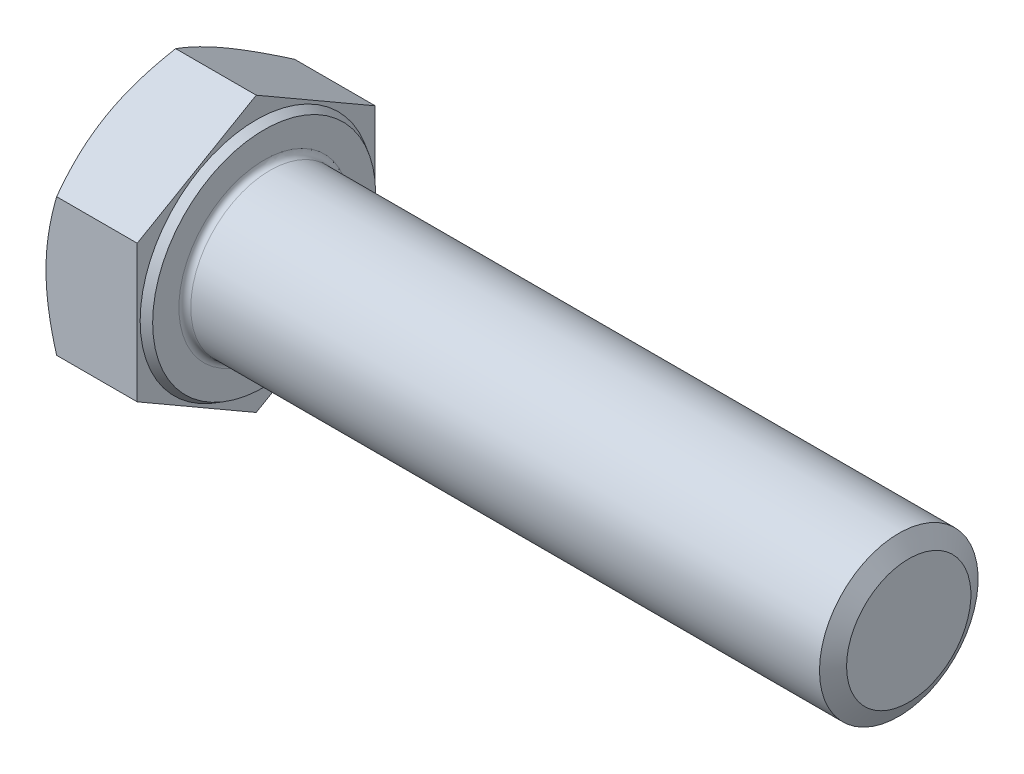
ISO-10303-21;
HEADER;
FILE_DESCRIPTION(('STEP AP214'),'2;1');
FILE_NAME('part.step','',(''),(''),'','','');
FILE_SCHEMA(('AUTOMOTIVE_DESIGN { 1 0 10303 214 1 1 1 1 }'));
ENDSEC;
DATA;
#1=APPLICATION_CONTEXT('core data for automotive mechanical design processes');
#2=APPLICATION_PROTOCOL_DEFINITION('international standard','automotive_design',2000,#1);
#3=PRODUCT_CONTEXT('',#1,'mechanical');
#4=PRODUCT('Part','Part','',(#3));
#5=PRODUCT_RELATED_PRODUCT_CATEGORY('part','',(#4));
#6=PRODUCT_DEFINITION_FORMATION('','',#4);
#7=PRODUCT_DEFINITION_CONTEXT('part definition',#1,'design');
#8=PRODUCT_DEFINITION('design','',#6,#7);
#9=PRODUCT_DEFINITION_SHAPE('','',#8);
#10=(LENGTH_UNIT() NAMED_UNIT(*) SI_UNIT(.MILLI.,.METRE.));
#11=(NAMED_UNIT(*) PLANE_ANGLE_UNIT() SI_UNIT($,.RADIAN.));
#12=(NAMED_UNIT(*) SI_UNIT($,.STERADIAN.) SOLID_ANGLE_UNIT());
#13=UNCERTAINTY_MEASURE_WITH_UNIT(LENGTH_MEASURE(1.E-05),#10,'distance_accuracy_value','');
#14=(GEOMETRIC_REPRESENTATION_CONTEXT(3) GLOBAL_UNCERTAINTY_ASSIGNED_CONTEXT((#13)) GLOBAL_UNIT_ASSIGNED_CONTEXT((#10,
#11,#12)) REPRESENTATION_CONTEXT('',''));
#15=CARTESIAN_POINT('',(0.,0.,0.));
#16=DIRECTION('',(0.,0.,1.));
#17=DIRECTION('',(1.,0.,0.));
#18=AXIS2_PLACEMENT_3D('',#15,#16,#17);
#19=CARTESIAN_POINT('',(0.,0.,0.));
#20=DIRECTION('',(-1.,0.,0.));
#21=DIRECTION('',(0.,0.,1.));
#22=AXIS2_PLACEMENT_3D('',#19,#20,#21);
#23=CYLINDRICAL_SURFACE('',#22,8.);
#24=CARTESIAN_POINT('',(10.6,0.,0.));
#25=DIRECTION('',(1.,0.,0.));
#26=DIRECTION('',(0.,0.,-1.));
#27=AXIS2_PLACEMENT_3D('',#24,#25,#26);
#28=CIRCLE('',#27,8.);
#29=CARTESIAN_POINT('',(10.6,0.,-8.));
#30=VERTEX_POINT('',#29);
#31=EDGE_CURVE('E11',#30,#30,#28,.T.);
#32=ORIENTED_EDGE('',*,*,#31,.T.);
#33=EDGE_LOOP('',(#32));
#34=FACE_BOUND('',#33,.T.);
#35=CARTESIAN_POINT('',(74.,0.,0.));
#36=DIRECTION('',(-1.,0.,0.));
#37=DIRECTION('',(0.,0.,1.));
#38=AXIS2_PLACEMENT_3D('',#35,#36,#37);
#39=CIRCLE('',#38,8.);
#40=CARTESIAN_POINT('',(74.,0.,8.));
#41=VERTEX_POINT('',#40);
#42=EDGE_CURVE('E453',#41,#41,#39,.T.);
#43=ORIENTED_EDGE('',*,*,#42,.T.);
#44=EDGE_LOOP('',(#43));
#45=FACE_BOUND('',#44,.T.);
#46=ADVANCED_FACE('F48',(#34,#45),#23,.T.);
#47=CARTESIAN_POINT('',(10.,6.9282032302755,-12.));
#48=DIRECTION('',(0.,-0.866025403784438,0.500000000000001));
#49=DIRECTION('',(0.,-0.500000000000001,-0.866025403784438));
#50=AXIS2_PLACEMENT_3D('',#47,#48,#49);
#51=PLANE('',#50);
#52=DIRECTION('',(0.,0.500000000000001,0.866025403784438));
#53=VECTOR('',#52,1.);
#54=CARTESIAN_POINT('',(9.2,6.9282032302755,-12.));
#55=LINE('',#54,#53);
#56=CARTESIAN_POINT('',(9.2,6.92820323027552,-12.));
#57=VERTEX_POINT('',#56);
#58=CARTESIAN_POINT('',(9.2,13.856406460551,0.));
#59=VERTEX_POINT('',#58);
#60=EDGE_CURVE('E125',#57,#59,#55,.T.);
#61=ORIENTED_EDGE('',*,*,#60,.F.);
#62=DIRECTION('',(-1.,0.,0.));
#63=VECTOR('',#62,1.);
#64=CARTESIAN_POINT('',(10.,6.9282032302755,-12.));
#65=LINE('',#64,#63);
#66=CARTESIAN_POINT('',(1.07179676972448,6.9282032302755,-12.));
#67=VERTEX_POINT('',#66);
#68=EDGE_CURVE('E311',#57,#67,#65,.T.);
#69=ORIENTED_EDGE('',*,*,#68,.T.);
#70=CARTESIAN_POINT('',(1.07186343722448,13.8565219306049,0.0002));
#71=CARTESIAN_POINT('',(0.983949632185865,13.7042251307133,-0.263585795242262));
#72=CARTESIAN_POINT('',(0.900025997556671,13.5513604901482,-0.528355119381799));
#73=CARTESIAN_POINT('',(0.741266218872845,13.244405350712,-1.06001701652966));
#74=CARTESIAN_POINT('',(0.666433063673587,13.0903144663124,-1.32691025729307));
#75=CARTESIAN_POINT('',(0.457017539854156,12.6255589607763,-2.13189040597901));
#76=CARTESIAN_POINT('',(0.337903236722855,12.3130596590925,-2.6731550738251));
#77=CARTESIAN_POINT('',(0.198231061003147,11.8454187840152,-3.483132829155));
#78=CARTESIAN_POINT('',(0.158443797040446,11.6916742921315,-3.74942610048137));
#79=CARTESIAN_POINT('',(0.0917233692170911,11.3834734611381,-4.28324559869684));
#80=CARTESIAN_POINT('',(0.0647904527677754,11.2290171083848,-4.55077184921738));
#81=CARTESIAN_POINT('',(0.0244685919169262,10.9198468953819,-5.08627036632535));
#82=CARTESIAN_POINT('',(0.0110635528823189,10.7651335610083,-5.35424172206873));
#83=CARTESIAN_POINT('',(-0.00191690624283213,10.4555635369292,-5.89043273227404));
#84=CARTESIAN_POINT('',(-0.00149275363726567,10.3007068518009,-6.15865237880804));
#85=CARTESIAN_POINT('',(0.0122200193427722,10.011202064883,-6.6600893787841));
#86=CARTESIAN_POINT('',(0.0238359825785307,9.87653331649855,-6.89334249317776));
#87=CARTESIAN_POINT('',(0.0573080088723785,9.60750555673725,-7.35931224173077));
#88=CARTESIAN_POINT('',(0.0791647962662185,9.47314656794543,-7.59202883677177));
#89=CARTESIAN_POINT('',(0.13273741654291,9.20481134519089,-8.05679907604294));
#90=CARTESIAN_POINT('',(0.164461392492924,9.07083551994084,-8.288852012362));
#91=CARTESIAN_POINT('',(0.237211775670441,8.80351197901488,-8.75186996730498));
#92=CARTESIAN_POINT('',(0.278238815183198,8.67016430666066,-8.98283491089354));
#93=CARTESIAN_POINT('',(0.416311653281804,8.2653799638421,-9.68394195876367));
#94=CARTESIAN_POINT('',(0.527124888339327,7.99511549730955,-10.1520537462785));
#95=CARTESIAN_POINT('',(0.778625766937884,7.45861659251288,-11.0812971075914));
#96=CARTESIAN_POINT('',(0.919254342659384,7.19237528499142,-11.5424405792922));
#97=CARTESIAN_POINT('',(1.07186343722448,6.92808776022166,-12.0002));
#98=B_SPLINE_CURVE_WITH_KNOTS('',3,(#70,#71,#72,#73,#74,#75,#76,#77,#78,#79,#80,#81,#82,#83,#84,
#85,#86,#87,#88,#89,#90,#91,#92,#93,#94,#95,#96,#97),.UNSPECIFIED.,.F.,.F.,(4,2,2,2,2,2,2,2,2,2,
2,2,2,4),(0.,0.951004872251246,1.90232158356438,3.80900466161369,4.73894551413571,
5.6689042647761,6.59775529889866,7.52657763276931,8.33514643820579,9.1437724425275,
9.95306755799766,10.7624176939264,12.4167102786892,14.0677556316691),.UNSPECIFIED.);
#99=CARTESIAN_POINT('',(0.,10.3923048454133,-6.00000000000001));
#100=VERTEX_POINT('',#99);
#101=EDGE_CURVE('E236',#100,#67,#98,.T.);
#102=ORIENTED_EDGE('',*,*,#101,.F.);
#103=CARTESIAN_POINT('',(1.07179676972449,13.856406460551,0.));
#104=VERTEX_POINT('',#103);
#105=EDGE_CURVE('E71',#104,#100,#98,.T.);
#106=ORIENTED_EDGE('',*,*,#105,.F.);
#107=DIRECTION('',(-1.,0.,0.));
#108=VECTOR('',#107,1.);
#109=CARTESIAN_POINT('',(10.,13.856406460551,0.));
#110=LINE('',#109,#108);
#111=EDGE_CURVE('E144',#59,#104,#110,.T.);
#112=ORIENTED_EDGE('',*,*,#111,.F.);
#113=EDGE_LOOP('',(#61,#69,#102,#106,#112));
#114=FACE_BOUND('',#113,.T.);
#115=ADVANCED_FACE('F179',(#114),#51,.F.);
#116=CARTESIAN_POINT('',(10.,13.856406460551,0.));
#117=DIRECTION('',(0.,-0.866025403784438,-0.500000000000001));
#118=DIRECTION('',(0.,0.500000000000001,-0.866025403784438));
#119=AXIS2_PLACEMENT_3D('',#116,#117,#118);
#120=PLANE('',#119);
#121=DIRECTION('',(0.,-0.500000000000001,0.866025403784438));
#122=VECTOR('',#121,1.);
#123=CARTESIAN_POINT('',(9.2,13.856406460551,0.));
#124=LINE('',#123,#122);
#125=CARTESIAN_POINT('',(9.2,6.92820323027553,12.));
#126=VERTEX_POINT('',#125);
#127=EDGE_CURVE('E119',#59,#126,#124,.T.);
#128=ORIENTED_EDGE('',*,*,#127,.F.);
#129=ORIENTED_EDGE('',*,*,#111,.T.);
#130=CARTESIAN_POINT('',(1.07186343722448,6.92808776022166,12.0002));
#131=CARTESIAN_POINT('',(0.983949632185859,7.08038456011318,11.7364142047577));
#132=CARTESIAN_POINT('',(0.900025997556666,7.2332492006783,11.4716448806182));
#133=CARTESIAN_POINT('',(0.74126621887284,7.54020434011449,10.9399829834703));
#134=CARTESIAN_POINT('',(0.666433063673582,7.69429522451413,10.6730897427069));
#135=CARTESIAN_POINT('',(0.45701753985415,8.15905073005026,9.86810959402099));
#136=CARTESIAN_POINT('',(0.337903236722848,8.47155003173404,9.3268449261749));
#137=CARTESIAN_POINT('',(0.198231061003143,8.93919090681137,8.51686717084501));
#138=CARTESIAN_POINT('',(0.158443797040443,9.09293539869503,8.25057389951863));
#139=CARTESIAN_POINT('',(0.09172336921709,9.40113622968841,7.71675440130316));
#140=CARTESIAN_POINT('',(0.0647904527677747,9.55559258244173,7.44922815078262));
#141=CARTESIAN_POINT('',(0.0244685919169258,9.86476279544466,6.91372963367465));
#142=CARTESIAN_POINT('',(0.0110635528823185,10.0194761298182,6.64575827793128));
#143=CARTESIAN_POINT('',(-0.00191690624283177,10.3290461538973,6.10956726772596));
#144=CARTESIAN_POINT('',(-0.00149275363726467,10.4839028390257,5.84134762119196));
#145=CARTESIAN_POINT('',(0.0122200193427742,10.7734076259435,5.3399106212159));
#146=CARTESIAN_POINT('',(0.023835982578533,10.908076374328,5.10665750682225));
#147=CARTESIAN_POINT('',(0.0573080088723811,11.1771041340893,4.64068775826924));
#148=CARTESIAN_POINT('',(0.0791647962662211,11.3114631228811,4.40797116322823));
#149=CARTESIAN_POINT('',(0.132737416542913,11.5797983456356,3.94320092395706));
#150=CARTESIAN_POINT('',(0.164461392492928,11.7137741708857,3.711147987638));
#151=CARTESIAN_POINT('',(0.237211775670446,11.9810977118116,3.24813003269502));
#152=CARTESIAN_POINT('',(0.278238815183203,12.1144453841659,3.01716508910646));
#153=CARTESIAN_POINT('',(0.416311653281809,12.5192297269844,2.31605804123633));
#154=CARTESIAN_POINT('',(0.527124888339332,12.789494193517,1.84794625372147));
#155=CARTESIAN_POINT('',(0.77862576693789,13.3259930983136,0.918702892408578));
#156=CARTESIAN_POINT('',(0.91925434265939,13.5922344058351,0.457559420707846));
#157=CARTESIAN_POINT('',(1.07186343722448,13.8565219306049,-0.000200000000000254));
#158=B_SPLINE_CURVE_WITH_KNOTS('',3,(#130,#131,#132,#133,#134,#135,#136,#137,#138,#139,#140,
#141,#142,#143,#144,#145,#146,#147,#148,#149,#150,#151,#152,#153,#154,#155,#156,#157),
.UNSPECIFIED.,.F.,.F.,(4,2,2,2,2,2,2,2,2,2,2,2,2,4),(0.,0.951004872251245,1.90232158356437,
3.80900466161369,4.7389455141357,5.66890426477609,6.59775529889866,7.5265776327693,
8.33514643820579,9.1437724425275,9.95306755799766,10.7624176939264,12.4167102786892,
14.0677556316691),.UNSPECIFIED.);
#159=CARTESIAN_POINT('',(0.,10.3923048454133,6.00000000000001));
#160=VERTEX_POINT('',#159);
#161=EDGE_CURVE('E248',#160,#104,#158,.T.);
#162=ORIENTED_EDGE('',*,*,#161,.F.);
#163=CARTESIAN_POINT('',(1.07179676972448,6.9282032302755,12.));
#164=VERTEX_POINT('',#163);
#165=EDGE_CURVE('E143',#164,#160,#158,.T.);
#166=ORIENTED_EDGE('',*,*,#165,.F.);
#167=DIRECTION('',(-1.,0.,0.));
#168=VECTOR('',#167,1.);
#169=CARTESIAN_POINT('',(10.,6.9282032302755,12.));
#170=LINE('',#169,#168);
#171=EDGE_CURVE('E134',#126,#164,#170,.T.);
#172=ORIENTED_EDGE('',*,*,#171,.F.);
#173=EDGE_LOOP('',(#128,#129,#162,#166,#172));
#174=FACE_BOUND('',#173,.T.);
#175=ADVANCED_FACE('F141',(#174),#120,.F.);
#176=CARTESIAN_POINT('',(10.,6.9282032302755,12.));
#177=DIRECTION('',(0.,0.,-1.));
#178=DIRECTION('',(-1.,0.,0.));
#179=AXIS2_PLACEMENT_3D('',#176,#177,#178);
#180=PLANE('',#179);
#181=DIRECTION('',(0.,-1.,0.));
#182=VECTOR('',#181,1.);
#183=CARTESIAN_POINT('',(9.2,6.9282032302755,12.));
#184=LINE('',#183,#182);
#185=CARTESIAN_POINT('',(9.2,-6.92820323027552,12.));
#186=VERTEX_POINT('',#185);
#187=EDGE_CURVE('E122',#126,#186,#184,.T.);
#188=ORIENTED_EDGE('',*,*,#187,.F.);
#189=ORIENTED_EDGE('',*,*,#171,.T.);
#190=CARTESIAN_POINT('',(5.9379652249916,-18.7780422876809,12.));
#191=CARTESIAN_POINT('',(5.81013580153171,-18.5152821742341,12.));
#192=CARTESIAN_POINT('',(5.68293119845564,-18.2522182359297,12.));
#193=CARTESIAN_POINT('',(5.42991281410037,-17.7254193681017,12.));
#194=CARTESIAN_POINT('',(5.30409904630056,-17.4616844321055,12.));
#195=CARTESIAN_POINT('',(4.92892368290875,-16.6693101743882,12.));
#196=CARTESIAN_POINT('',(4.68186469152994,-16.1395765656331,12.));
#197=CARTESIAN_POINT('',(4.19405479952982,-15.0738169190078,12.));
#198=CARTESIAN_POINT('',(3.95334413341026,-14.5377724221017,12.));
#199=CARTESIAN_POINT('',(3.48154718674623,-13.4614790602081,12.));
#200=CARTESIAN_POINT('',(3.25046046260965,-12.9212303903669,12.));
#201=CARTESIAN_POINT('',(2.79294900667129,-11.8175688689819,12.));
#202=CARTESIAN_POINT('',(2.56693655895501,-11.2539842320577,12.));
#203=CARTESIAN_POINT('',(2.13161283273163,-10.1202797331247,12.));
#204=CARTESIAN_POINT('',(1.92230340506571,-9.55015915485907,12.));
#205=CARTESIAN_POINT('',(1.52576124918553,-8.40350794466347,12.));
#206=CARTESIAN_POINT('',(1.33848523718246,-7.82699240007888,12.));
#207=CARTESIAN_POINT('',(0.99189670018006,-6.66563869600162,12.));
#208=CARTESIAN_POINT('',(0.832575542892166,-6.08080316618919,12.));
#209=CARTESIAN_POINT('',(0.62068119702557,-5.19882791551971,12.));
#210=CARTESIAN_POINT('',(0.55471315085529,-4.90488790342147,12.));
#211=CARTESIAN_POINT('',(0.432574422995981,-4.31496880701142,12.));
#212=CARTESIAN_POINT('',(0.37640354844944,-4.01898976295725,12.));
#213=CARTESIAN_POINT('',(0.274840044165109,-3.42518449183526,12.));
#214=CARTESIAN_POINT('',(0.229447213467064,-3.1273582993144,12.));
#215=CARTESIAN_POINT('',(0.150338666864213,-2.53016033534832,12.));
#216=CARTESIAN_POINT('',(0.116622484244828,-2.23078862616279,12.));
#217=CARTESIAN_POINT('',(0.061969320128323,-1.63489952034464,12.));
#218=CARTESIAN_POINT('',(0.0408679219512438,-1.33839729705375,12.));
#219=CARTESIAN_POINT('',(0.0112310519021945,-0.744766224338127,12.));
#220=CARTESIAN_POINT('',(0.00269536679662729,-0.447637385632423,12.));
#221=CARTESIAN_POINT('',(-0.00160621157202331,0.146715096942927,12.));
#222=CARTESIAN_POINT('',(0.00262788821472195,0.443938740760886,12.));
#223=CARTESIAN_POINT('',(0.0237602868313374,1.03793867900077,12.));
#224=CARTESIAN_POINT('',(0.0406591751133799,1.33471495195666,12.));
#225=CARTESIAN_POINT('',(0.0957363037225937,2.04293812544911,12.));
#226=CARTESIAN_POINT('',(0.139644388869434,2.45394931182504,12.));
#227=CARTESIAN_POINT('',(0.249393763135934,3.27301119833394,12.));
#228=CARTESIAN_POINT('',(0.315237895547362,3.68106150767658,12.));
#229=CARTESIAN_POINT('',(0.542190666924389,4.90025554060104,12.));
#230=CARTESIAN_POINT('',(0.732681274216202,5.70600726238708,12.));
#231=CARTESIAN_POINT('',(1.06415793334627,6.91101760118602,12.));
#232=CARTESIAN_POINT('',(1.18384338751807,7.31649624625233,12.));
#233=CARTESIAN_POINT('',(1.43593551476421,8.12351840181149,12.));
#234=CARTESIAN_POINT('',(1.56834227450981,8.52506188547325,12.));
#235=CARTESIAN_POINT('',(1.8437286581276,9.32433402651663,12.));
#236=CARTESIAN_POINT('',(1.9867050037192,9.72206382387893,12.));
#237=CARTESIAN_POINT('',(2.28151949374363,10.5142091061849,12.));
#238=CARTESIAN_POINT('',(2.43335751674009,10.908624636461,12.));
#239=CARTESIAN_POINT('',(2.81137815071346,11.8636440545741,12.));
#240=CARTESIAN_POINT('',(3.04143185567875,12.4227131308577,12.));
#241=CARTESIAN_POINT('',(3.51333410611205,13.5358669332653,12.));
#242=CARTESIAN_POINT('',(3.75518348678292,14.0899513031431,12.));
#243=CARTESIAN_POINT('',(4.24823475653156,15.1941025186566,12.));
#244=CARTESIAN_POINT('',(4.49943904043688,15.7441682918315,12.));
#245=CARTESIAN_POINT('',(5.00924552887371,16.8408349536019,12.));
#246=CARTESIAN_POINT('',(5.26784754956297,17.3874359278899,12.));
#247=CARTESIAN_POINT('',(5.7913387992848,18.4784293923002,12.));
#248=CARTESIAN_POINT('',(6.05623527465221,19.0228183989982,12.));
#249=CARTESIAN_POINT('',(6.59090796254076,20.1091945794083,12.));
#250=CARTESIAN_POINT('',(6.86068419945745,20.6511817410959,12.));
#251=CARTESIAN_POINT('',(7.40421496208664,21.7330545936328,12.));
#252=CARTESIAN_POINT('',(7.67796889125699,22.2729405845111,12.));
#253=CARTESIAN_POINT('',(8.22882461462083,23.3510028742049,12.));
#254=CARTESIAN_POINT('',(8.50592642242827,23.8891791660568,12.));
#255=CARTESIAN_POINT('',(9.29226596146123,25.4066579940567,12.));
#256=CARTESIAN_POINT('',(9.80475659623532,26.3842748096138,12.));
#257=CARTESIAN_POINT('',(10.8366490575024,28.3358962609434,12.));
#258=CARTESIAN_POINT('',(11.3560511647271,29.3099007479222,12.));
#259=CARTESIAN_POINT('',(12.3986980712295,31.2524398572292,12.));
#260=CARTESIAN_POINT('',(12.9219285874181,32.2209821512087,12.));
#261=CARTESIAN_POINT('',(13.709817261168,33.6721037842397,12.));
#262=CARTESIAN_POINT('',(13.9729461083086,34.1555146940213,12.));
#263=CARTESIAN_POINT('',(14.5001155834576,35.1218381868036,12.));
#264=CARTESIAN_POINT('',(14.7641562100751,35.6047507705631,12.));
#265=CARTESIAN_POINT('',(15.0285993289473,36.0874429112689,12.));
#266=B_SPLINE_CURVE_WITH_KNOTS('',3,(#190,#191,#192,#193,#194,#195,#196,#197,#198,#199,#200,
#201,#202,#203,#204,#205,#206,#207,#208,#209,#210,#211,#212,#213,#214,#215,#216,#217,#218,#219,
#220,#221,#222,#223,#224,#225,#226,#227,#228,#229,#230,#231,#232,#233,#234,#235,#236,#237,#238,
#239,#240,#241,#242,#243,#244,#245,#246,#247,#248,#249,#250,#251,#252,#253,#254,#255,#256,#257,
#258,#259,#260,#261,#262,#263,#264,#265),.UNSPECIFIED.,.F.,.F.,(4,2,2,2,2,2,2,2,2,2,2,2,2,2,2,2,
2,2,2,2,2,2,2,2,2,2,2,2,2,2,2,2,2,2,2,2,2,4),(0.,0.876610778943413,1.75323004620523,
3.50671945197806,5.26947518067904,7.03214956933033,8.85359042595666,10.6752328347611,
12.4932347351832,14.3106742559303,15.2142921518805,16.117892258087,17.0214755150421,
17.9250226516858,18.816520871687,19.7080039632539,20.5994865696161,21.4910106704728,
22.7303633484055,23.9698767304575,26.4502079763428,27.7184187234137,28.9866381115161,
30.2544657836991,31.5222760862275,33.3357454112635,35.1493433274816,36.9634087547281,
38.7774291394606,40.5936500751824,42.4098800933003,44.2258404831105,46.0418082599001,
49.3531754129826,52.664677481008,55.9671781132062,57.6183303465534,59.2694800621134),.UNSPECIFIED.);
#267=CARTESIAN_POINT('',(0.,0.,12.));
#268=VERTEX_POINT('',#267);
#269=EDGE_CURVE('E254',#268,#164,#266,.T.);
#270=ORIENTED_EDGE('',*,*,#269,.F.);
#271=CARTESIAN_POINT('',(1.07179676972449,-6.92820323027552,12.));
#272=VERTEX_POINT('',#271);
#273=EDGE_CURVE('E310',#272,#268,#266,.T.);
#274=ORIENTED_EDGE('',*,*,#273,.F.);
#275=DIRECTION('',(-1.,0.,0.));
#276=VECTOR('',#275,1.);
#277=CARTESIAN_POINT('',(10.,-6.92820323027552,12.));
#278=LINE('',#277,#276);
#279=EDGE_CURVE('E137',#186,#272,#278,.T.);
#280=ORIENTED_EDGE('',*,*,#279,.F.);
#281=EDGE_LOOP('',(#188,#189,#270,#274,#280));
#282=FACE_BOUND('',#281,.T.);
#283=ADVANCED_FACE('F132',(#282),#180,.F.);
#284=CARTESIAN_POINT('',(10.,-13.856406460551,0.));
#285=DIRECTION('',(0.,0.866025403784438,-0.500000000000001));
#286=DIRECTION('',(0.,0.500000000000001,0.866025403784438));
#287=AXIS2_PLACEMENT_3D('',#284,#285,#286);
#288=PLANE('',#287);
#289=DIRECTION('',(0.,-0.500000000000001,-0.866025403784438));
#290=VECTOR('',#289,1.);
#291=CARTESIAN_POINT('',(9.2,-13.856406460551,0.));
#292=LINE('',#291,#290);
#293=CARTESIAN_POINT('',(9.2,-13.856406460551,0.));
#294=VERTEX_POINT('',#293);
#295=EDGE_CURVE('E138',#186,#294,#292,.T.);
#296=ORIENTED_EDGE('',*,*,#295,.F.);
#297=ORIENTED_EDGE('',*,*,#279,.T.);
#298=CARTESIAN_POINT('',(1.0718634372245,-13.8565219306049,-0.000199999999999751));
#299=CARTESIAN_POINT('',(0.983949632185878,-13.7042251307134,0.263585795242262));
#300=CARTESIAN_POINT('',(0.900025997556684,-13.5513604901482,0.5283551193818));
#301=CARTESIAN_POINT('',(0.741266218872857,-13.2444053507121,1.06001701652966));
#302=CARTESIAN_POINT('',(0.666433063673599,-13.0903144663124,1.32691025729307));
#303=CARTESIAN_POINT('',(0.457017539854167,-12.6255589607763,2.13189040597901));
#304=CARTESIAN_POINT('',(0.337903236722865,-12.3130596590925,2.67315507382511));
#305=CARTESIAN_POINT('',(0.198231061003158,-11.8454187840152,3.483132829155));
#306=CARTESIAN_POINT('',(0.158443797040457,-11.6916742921315,3.74942610048138));
#307=CARTESIAN_POINT('',(0.0917233692171029,-11.3834734611381,4.28324559869685));
#308=CARTESIAN_POINT('',(0.0647904527677877,-11.2290171083848,4.55077184921739));
#309=CARTESIAN_POINT('',(0.0244685919169379,-10.9198468953819,5.08627036632536));
#310=CARTESIAN_POINT('',(0.0110635528823294,-10.7651335610083,5.35424172206874));
#311=CARTESIAN_POINT('',(-0.00191690624282212,-10.4555635369292,5.89043273227405));
#312=CARTESIAN_POINT('',(-0.00149275363725498,-10.3007068518009,6.15865237880805));
#313=CARTESIAN_POINT('',(0.0122200193427835,-10.0112020648831,6.66008937878412));
#314=CARTESIAN_POINT('',(0.0238359825785419,-9.87653331649857,6.89334249317777));
#315=CARTESIAN_POINT('',(0.0573080088723893,-9.60750555673726,7.35931224173078));
#316=CARTESIAN_POINT('',(0.079164796266229,-9.47314656794545,7.59202883677178));
#317=CARTESIAN_POINT('',(0.132737416542921,-9.20481134519091,8.05679907604295));
#318=CARTESIAN_POINT('',(0.164461392492935,-9.07083551994086,8.28885201236201));
#319=CARTESIAN_POINT('',(0.237211775670452,-8.8035119790149,8.75186996730499));
#320=CARTESIAN_POINT('',(0.278238815183208,-8.67016430666068,8.98283491089355));
#321=CARTESIAN_POINT('',(0.416311653281812,-8.26537996384211,9.68394195876367));
#322=CARTESIAN_POINT('',(0.527124888339335,-7.99511549730957,10.1520537462785));
#323=CARTESIAN_POINT('',(0.778625766937893,-7.4586165925129,11.0812971075914));
#324=CARTESIAN_POINT('',(0.919254342659392,-7.19237528499145,11.5424405792922));
#325=CARTESIAN_POINT('',(1.07186343722448,-6.92808776022168,12.0002));
#326=B_SPLINE_CURVE_WITH_KNOTS('',3,(#298,#299,#300,#301,#302,#303,#304,#305,#306,#307,#308,
#309,#310,#311,#312,#313,#314,#315,#316,#317,#318,#319,#320,#321,#322,#323,#324,#325),
.UNSPECIFIED.,.F.,.F.,(4,2,2,2,2,2,2,2,2,2,2,2,2,4),(0.,0.951004872251247,1.90232158356438,
3.80900466161369,4.73894551413571,5.66890426477611,6.59775529889867,7.52657763276932,
8.3351464382058,9.14377244252751,9.95306755799767,10.7624176939264,12.4167102786892,
14.0677556316691),.UNSPECIFIED.);
#327=CARTESIAN_POINT('',(0.,-10.3923048454133,6.00000000000001));
#328=VERTEX_POINT('',#327);
#329=EDGE_CURVE('E309',#328,#272,#326,.T.);
#330=ORIENTED_EDGE('',*,*,#329,.F.);
#331=CARTESIAN_POINT('',(1.0717967697245,-13.856406460551,0.));
#332=VERTEX_POINT('',#331);
#333=EDGE_CURVE('E242',#332,#328,#326,.T.);
#334=ORIENTED_EDGE('',*,*,#333,.F.);
#335=DIRECTION('',(-1.,0.,0.));
#336=VECTOR('',#335,1.);
#337=CARTESIAN_POINT('',(10.,-13.856406460551,0.));
#338=LINE('',#337,#336);
#339=EDGE_CURVE('E148',#294,#332,#338,.T.);
#340=ORIENTED_EDGE('',*,*,#339,.F.);
#341=EDGE_LOOP('',(#296,#297,#330,#334,#340));
#342=FACE_BOUND('',#341,.T.);
#343=ADVANCED_FACE('F266',(#342),#288,.F.);
#344=CARTESIAN_POINT('',(10.,-6.92820323027553,-12.));
#345=DIRECTION('',(0.,0.866025403784438,0.500000000000001));
#346=DIRECTION('',(0.,-0.500000000000001,0.866025403784438));
#347=AXIS2_PLACEMENT_3D('',#344,#345,#346);
#348=PLANE('',#347);
#349=DIRECTION('',(0.,0.500000000000001,-0.866025403784438));
#350=VECTOR('',#349,1.);
#351=CARTESIAN_POINT('',(9.2,-6.92820323027553,-12.));
#352=LINE('',#351,#350);
#353=CARTESIAN_POINT('',(9.2,-6.92820323027553,-12.));
#354=VERTEX_POINT('',#353);
#355=EDGE_CURVE('E63',#294,#354,#352,.T.);
#356=ORIENTED_EDGE('',*,*,#355,.F.);
#357=ORIENTED_EDGE('',*,*,#339,.T.);
#358=CARTESIAN_POINT('',(1.07186343722448,-6.92808776022169,-12.0002));
#359=CARTESIAN_POINT('',(0.983949632185868,-7.08038456011321,-11.7364142047577));
#360=CARTESIAN_POINT('',(0.900025997556674,-7.23324920067833,-11.4716448806182));
#361=CARTESIAN_POINT('',(0.741266218872849,-7.54020434011451,-10.9399829834703));
#362=CARTESIAN_POINT('',(0.666433063673591,-7.69429522451416,-10.6730897427069));
#363=CARTESIAN_POINT('',(0.457017539854161,-8.15905073005029,-9.86810959402099));
#364=CARTESIAN_POINT('',(0.337903236722861,-8.47155003173407,-9.3268449261749));
#365=CARTESIAN_POINT('',(0.198231061003155,-8.93919090681139,-8.51686717084501));
#366=CARTESIAN_POINT('',(0.158443797040455,-9.09293539869506,-8.25057389951863));
#367=CARTESIAN_POINT('',(0.0917233692171006,-9.40113622968843,-7.71675440130316));
#368=CARTESIAN_POINT('',(0.0647904527677853,-9.55559258244176,-7.44922815078262));
#369=CARTESIAN_POINT('',(0.0244685919169369,-9.86476279544469,-6.91372963367465));
#370=CARTESIAN_POINT('',(0.0110635528823299,-10.0194761298182,-6.64575827793127));
#371=CARTESIAN_POINT('',(-0.0019169062428196,-10.3290461538973,-6.10956726772596));
#372=CARTESIAN_POINT('',(-0.00149275363725193,-10.4839028390257,-5.84134762119196));
#373=CARTESIAN_POINT('',(0.012220019342787,-10.7734076259435,-5.33991062121589));
#374=CARTESIAN_POINT('',(0.0238359825785454,-10.908076374328,-5.10665750682224));
#375=CARTESIAN_POINT('',(0.0573080088723938,-11.1771041340893,-4.64068775826923));
#376=CARTESIAN_POINT('',(0.0791647962662346,-11.3114631228811,-4.40797116322823));
#377=CARTESIAN_POINT('',(0.132737416542927,-11.5797983456357,-3.94320092395705));
#378=CARTESIAN_POINT('',(0.164461392492941,-11.7137741708857,-3.71114798763799));
#379=CARTESIAN_POINT('',(0.237211775670459,-11.9810977118117,-3.24813003269501));
#380=CARTESIAN_POINT('',(0.278238815183216,-12.1144453841659,-3.01716508910645));
#381=CARTESIAN_POINT('',(0.416311653281822,-12.5192297269845,-2.31605804123633));
#382=CARTESIAN_POINT('',(0.527124888339346,-12.789494193517,-1.84794625372147));
#383=CARTESIAN_POINT('',(0.778625766937904,-13.3259930983137,-0.918702892408575));
#384=CARTESIAN_POINT('',(0.919254342659404,-13.5922344058351,-0.457559420707843));
#385=CARTESIAN_POINT('',(1.0718634372245,-13.8565219306049,0.000200000000001023));
#386=B_SPLINE_CURVE_WITH_KNOTS('',3,(#358,#359,#360,#361,#362,#363,#364,#365,#366,#367,#368,
#369,#370,#371,#372,#373,#374,#375,#376,#377,#378,#379,#380,#381,#382,#383,#384,#385),
.UNSPECIFIED.,.F.,.F.,(4,2,2,2,2,2,2,2,2,2,2,2,2,4),(0.,0.951004872251245,1.90232158356437,
3.80900466161369,4.73894551413571,5.6689042647761,6.59775529889866,7.52657763276931,
8.3351464382058,9.1437724425275,9.95306755799767,10.7624176939264,12.4167102786892,
14.0677556316691),.UNSPECIFIED.);
#387=CARTESIAN_POINT('',(0.,-10.3923048454133,-6.00000000000001));
#388=VERTEX_POINT('',#387);
#389=EDGE_CURVE('E294',#388,#332,#386,.T.);
#390=ORIENTED_EDGE('',*,*,#389,.F.);
#391=CARTESIAN_POINT('',(1.07179676972449,-6.92820323027553,-12.));
#392=VERTEX_POINT('',#391);
#393=EDGE_CURVE('E216',#392,#388,#386,.T.);
#394=ORIENTED_EDGE('',*,*,#393,.F.);
#395=DIRECTION('',(-1.,0.,0.));
#396=VECTOR('',#395,1.);
#397=CARTESIAN_POINT('',(10.,-6.92820323027553,-12.));
#398=LINE('',#397,#396);
#399=EDGE_CURVE('E306',#354,#392,#398,.T.);
#400=ORIENTED_EDGE('',*,*,#399,.F.);
#401=EDGE_LOOP('',(#356,#357,#390,#394,#400));
#402=FACE_BOUND('',#401,.T.);
#403=ADVANCED_FACE('F200',(#402),#348,.F.);
#404=CARTESIAN_POINT('',(10.,6.9282032302755,-12.));
#405=DIRECTION('',(0.,0.,1.));
#406=DIRECTION('',(0.,-1.,0.));
#407=AXIS2_PLACEMENT_3D('',#404,#405,#406);
#408=PLANE('',#407);
#409=DIRECTION('',(0.,1.,0.));
#410=VECTOR('',#409,1.);
#411=CARTESIAN_POINT('',(9.2,6.9282032302755,-12.));
#412=LINE('',#411,#410);
#413=EDGE_CURVE('E156',#354,#57,#412,.T.);
#414=ORIENTED_EDGE('',*,*,#413,.F.);
#415=ORIENTED_EDGE('',*,*,#399,.T.);
#416=CARTESIAN_POINT('',(5.93796522688054,-18.7780422915637,-12.));
#417=CARTESIAN_POINT('',(5.81013580338123,-18.5152821780516,-12.));
#418=CARTESIAN_POINT('',(5.68293120026577,-18.2522182396819,-12.));
#419=CARTESIAN_POINT('',(5.42991281583177,-17.7254193717232,-12.));
#420=CARTESIAN_POINT('',(5.30409904799263,-17.4616844356616,-12.));
#421=CARTESIAN_POINT('',(4.92892368448296,-16.6693101777481,-12.));
#422=CARTESIAN_POINT('',(4.68186469302576,-16.139576568862,-12.));
#423=CARTESIAN_POINT('',(4.1940548008688,-15.0738169219726,-12.));
#424=CARTESIAN_POINT('',(3.95334413467082,-14.5377724249334,-12.));
#425=CARTESIAN_POINT('',(3.48154718785123,-13.4614790627728,-12.));
#426=CARTESIAN_POINT('',(3.25046046363751,-12.9212303927977,-12.));
#427=CARTESIAN_POINT('',(2.79294900754263,-11.8175688711343,-12.));
#428=CARTESIAN_POINT('',(2.56693655974715,-11.2539842340656,-12.));
#429=CARTESIAN_POINT('',(2.13161283336958,-10.1202797348412,-12.));
#430=CARTESIAN_POINT('',(1.92230340562868,-9.55015915642869,-12.));
#431=CARTESIAN_POINT('',(1.52576124960573,-8.40350794593668,-12.));
#432=CARTESIAN_POINT('',(1.33848523753484,-7.82699240120254,-12.));
#433=CARTESIAN_POINT('',(0.991896700407879,-6.66563869682204,-12.));
#434=CARTESIAN_POINT('',(0.83257554306323,-6.08080316685593,-12.));
#435=CARTESIAN_POINT('',(0.620681197115229,-5.19882791591539,-12.));
#436=CARTESIAN_POINT('',(0.554713150915105,-4.90488790370127,-12.));
#437=CARTESIAN_POINT('',(0.432574423003703,-4.31496880705781,-12.));
#438=CARTESIAN_POINT('',(0.376403548434913,-4.0189897628861,-12.));
#439=CARTESIAN_POINT('',(0.274840044114871,-3.42518449152774,-12.));
#440=CARTESIAN_POINT('',(0.229447213403359,-3.12735829888806,-12.));
#441=CARTESIAN_POINT('',(0.150338666783352,-2.53016033468332,-12.));
#442=CARTESIAN_POINT('',(0.116622484160278,-2.23078862537795,-12.));
#443=CARTESIAN_POINT('',(0.0619693200469878,-1.63489951932263,-12.));
#444=CARTESIAN_POINT('',(0.0408679218766192,-1.33839729591442,-12.));
#445=CARTESIAN_POINT('',(0.0112310518513537,-0.744766222964397,-12.));
#446=CARTESIAN_POINT('',(0.00269536676285951,-0.447637384141609,-12.));
#447=CARTESIAN_POINT('',(-0.00160621156152497,0.146715098667036,-12.));
#448=CARTESIAN_POINT('',(0.00262788825241536,0.443938742601204,-12.));
#449=CARTESIAN_POINT('',(0.0237602869328212,1.03793868107199,-12.));
#450=CARTESIAN_POINT('',(0.0406591752514601,1.33471495414258,-12.));
#451=CARTESIAN_POINT('',(0.0957363039506881,2.04293812781233,-12.));
#452=CARTESIAN_POINT('',(0.139644389149358,2.45394931425036,-12.));
#453=CARTESIAN_POINT('',(0.249393763522295,3.27301120088065,-12.));
#454=CARTESIAN_POINT('',(0.31523789598833,3.68106151028258,-12.));
#455=CARTESIAN_POINT('',(0.542190667530327,4.90025554338169,-12.));
#456=CARTESIAN_POINT('',(0.732681274933576,5.70600726527961,-12.));
#457=CARTESIAN_POINT('',(1.06415793422806,6.91101760424584,-12.));
#458=CARTESIAN_POINT('',(1.18384338845501,7.31649624936906,-12.));
#459=CARTESIAN_POINT('',(1.43593551580978,8.1235184050414,-12.));
#460=CARTESIAN_POINT('',(1.56834227560884,8.52506188875943,-12.));
#461=CARTESIAN_POINT('',(1.84372865933169,9.32433402991495,-12.));
#462=CARTESIAN_POINT('',(1.98670500497485,9.72206382733313,-12.));
#463=CARTESIAN_POINT('',(2.28151949510065,10.5142091097508,-12.));
#464=CARTESIAN_POINT('',(2.4333575181469,10.9086246400828,-12.));
#465=CARTESIAN_POINT('',(2.81137815220013,11.8636440582329,-12.));
#466=CARTESIAN_POINT('',(3.04143185719198,12.4227131344989,-12.));
#467=CARTESIAN_POINT('',(3.51333410767187,13.5358669368731,-12.));
#468=CARTESIAN_POINT('',(3.7551834883628,14.0899513067354,-12.));
#469=CARTESIAN_POINT('',(4.24823475814662,15.1941025222193,-12.));
#470=CARTESIAN_POINT('',(4.49943904206706,15.7441682953801,-12.));
#471=CARTESIAN_POINT('',(5.00924553053047,16.840834957124,-12.));
#472=CARTESIAN_POINT('',(5.26784755123118,17.3874359313995,-12.));
#473=CARTESIAN_POINT('',(5.79133880097284,18.4784293957852,-12.));
#474=CARTESIAN_POINT('',(6.0562352763486,19.0228184024713,-12.));
#475=CARTESIAN_POINT('',(6.5909079642517,20.1091945828584,-12.));
#476=CARTESIAN_POINT('',(6.86068420117457,20.651181744535,-12.));
#477=CARTESIAN_POINT('',(7.40421496381449,21.7330545970508,-12.));
#478=CARTESIAN_POINT('',(7.67796889298937,22.2729405879189,-12.));
#479=CARTESIAN_POINT('',(8.22882461636095,23.351002877593,-12.));
#480=CARTESIAN_POINT('',(8.50592642417159,23.8891791694354,-12.));
#481=CARTESIAN_POINT('',(9.29226596321909,25.4066579974227,-12.));
#482=CARTESIAN_POINT('',(9.80475659800341,26.3842748129771,-12.));
#483=CARTESIAN_POINT('',(10.8366490592887,28.3358962643026,-12.));
#484=CARTESIAN_POINT('',(11.3560511665214,29.3099007512799,-12.));
#485=CARTESIAN_POINT('',(12.3986980730396,31.2524398605869,-12.));
#486=CARTESIAN_POINT('',(12.921928589236,32.2209821545682,-12.));
#487=CARTESIAN_POINT('',(13.7098172629968,33.6721037876022,-12.));
#488=CARTESIAN_POINT('',(13.9729461101408,34.1555146973849,-12.));
#489=CARTESIAN_POINT('',(14.5001155852966,35.1218381901695,-12.));
#490=CARTESIAN_POINT('',(14.7641562119174,35.6047507739303,-12.));
#491=CARTESIAN_POINT('',(15.0285993307927,36.0874429146373,-12.));
#492=B_SPLINE_CURVE_WITH_KNOTS('',3,(#416,#417,#418,#419,#420,#421,#422,#423,#424,#425,#426,
#427,#428,#429,#430,#431,#432,#433,#434,#435,#436,#437,#438,#439,#440,#441,#442,#443,#444,#445,
#446,#447,#448,#449,#450,#451,#452,#453,#454,#455,#456,#457,#458,#459,#460,#461,#462,#463,#464,
#465,#466,#467,#468,#469,#470,#471,#472,#473,#474,#475,#476,#477,#478,#479,#480,#481,#482,#483,
#484,#485,#486,#487,#488,#489,#490,#491),.UNSPECIFIED.,.F.,.F.,(4,2,2,2,2,2,2,2,2,2,2,2,2,2,2,2,
2,2,2,2,2,2,2,2,2,2,2,2,2,2,2,2,2,2,2,2,2,4),(0.,0.876610779171213,1.75323004666083,
3.50671945288932,5.26947518205082,7.03214957116259,8.85359042827973,10.6752328375751,
12.4932347384866,14.3106742597227,15.2142921560316,16.1178922625967,17.02147551991,
17.9250226569119,18.8165208772623,19.7080039691785,20.5994865758902,21.4910106770964,
22.7303633552307,23.9698767374844,26.4502079837738,27.7184187310554,28.9866381193685,
30.2544657917616,31.5222760945001,33.3357454195175,35.1493433357168,36.963408762944,
38.7774291476574,40.5936500833578,42.4098801014544,44.2258404912437,46.0418082680123,
49.3531754211021,52.6646774891347,55.9671781213485,57.6183303547036,59.2694800702715),.UNSPECIFIED.);
#493=CARTESIAN_POINT('',(0.,0.,-12.));
#494=VERTEX_POINT('',#493);
#495=EDGE_CURVE('E205',#494,#392,#492,.F.);
#496=ORIENTED_EDGE('',*,*,#495,.F.);
#497=EDGE_CURVE('E213',#67,#494,#492,.F.);
#498=ORIENTED_EDGE('',*,*,#497,.F.);
#499=ORIENTED_EDGE('',*,*,#68,.F.);
#500=EDGE_LOOP('',(#414,#415,#496,#498,#499));
#501=FACE_BOUND('',#500,.T.);
#502=ADVANCED_FACE('F195',(#501),#408,.F.);
#503=CARTESIAN_POINT('',(0.,0.,0.));
#504=DIRECTION('',(1.,0.,0.));
#505=DIRECTION('',(0.,0.,-1.));
#506=AXIS2_PLACEMENT_3D('',#503,#504,#505);
#507=CONICAL_SURFACE('',#506,12.,1.0471975511966);
#508=ORIENTED_EDGE('',*,*,#393,.T.);
#509=CARTESIAN_POINT('',(0.,0.,0.));
#510=DIRECTION('',(1.,0.,0.));
#511=DIRECTION('',(0.,0.,-1.));
#512=AXIS2_PLACEMENT_3D('',#509,#510,#511);
#513=CIRCLE('',#512,12.);
#514=EDGE_CURVE('E146',#388,#494,#513,.T.);
#515=ORIENTED_EDGE('',*,*,#514,.T.);
#516=ORIENTED_EDGE('',*,*,#495,.T.);
#517=EDGE_LOOP('',(#508,#515,#516));
#518=FACE_BOUND('',#517,.T.);
#519=ADVANCED_FACE('F199',(#518),#507,.T.);
#520=ORIENTED_EDGE('',*,*,#333,.T.);
#521=EDGE_CURVE('E154',#328,#388,#513,.T.);
#522=ORIENTED_EDGE('',*,*,#521,.T.);
#523=ORIENTED_EDGE('',*,*,#389,.T.);
#524=EDGE_LOOP('',(#520,#522,#523));
#525=FACE_BOUND('',#524,.T.);
#526=ADVANCED_FACE('F227',(#525),#507,.T.);
#527=ORIENTED_EDGE('',*,*,#273,.T.);
#528=EDGE_CURVE('E290',#268,#328,#513,.T.);
#529=ORIENTED_EDGE('',*,*,#528,.T.);
#530=ORIENTED_EDGE('',*,*,#329,.T.);
#531=EDGE_LOOP('',(#527,#529,#530));
#532=FACE_BOUND('',#531,.T.);
#533=ADVANCED_FACE('F222',(#532),#507,.T.);
#534=ORIENTED_EDGE('',*,*,#269,.T.);
#535=ORIENTED_EDGE('',*,*,#165,.T.);
#536=CARTESIAN_POINT('',(0.,0.,0.));
#537=DIRECTION('',(-1.,0.,0.));
#538=DIRECTION('',(0.,0.,1.));
#539=AXIS2_PLACEMENT_3D('',#536,#537,#538);
#540=CIRCLE('',#539,12.);
#541=EDGE_CURVE('E214',#268,#160,#540,.T.);
#542=ORIENTED_EDGE('',*,*,#541,.F.);
#543=EDGE_LOOP('',(#534,#535,#542));
#544=FACE_BOUND('',#543,.T.);
#545=ADVANCED_FACE('F226',(#544),#507,.T.);
#546=ORIENTED_EDGE('',*,*,#161,.T.);
#547=ORIENTED_EDGE('',*,*,#105,.T.);
#548=EDGE_CURVE('E286',#100,#160,#513,.T.);
#549=ORIENTED_EDGE('',*,*,#548,.T.);
#550=EDGE_LOOP('',(#546,#547,#549));
#551=FACE_BOUND('',#550,.T.);
#552=ADVANCED_FACE('F292',(#551),#507,.T.);
#553=ORIENTED_EDGE('',*,*,#101,.T.);
#554=ORIENTED_EDGE('',*,*,#497,.T.);
#555=EDGE_CURVE('E155',#494,#100,#513,.T.);
#556=ORIENTED_EDGE('',*,*,#555,.T.);
#557=EDGE_LOOP('',(#553,#554,#556));
#558=FACE_BOUND('',#557,.T.);
#559=ADVANCED_FACE('F193',(#558),#507,.T.);
#560=CARTESIAN_POINT('',(0.,13.856406460551,0.));
#561=DIRECTION('',(1.,0.,0.));
#562=DIRECTION('',(0.,0.,-1.));
#563=AXIS2_PLACEMENT_3D('',#560,#561,#562);
#564=PLANE('',#563);
#565=ORIENTED_EDGE('',*,*,#555,.F.);
#566=ORIENTED_EDGE('',*,*,#514,.F.);
#567=ORIENTED_EDGE('',*,*,#521,.F.);
#568=ORIENTED_EDGE('',*,*,#528,.F.);
#569=ORIENTED_EDGE('',*,*,#541,.T.);
#570=ORIENTED_EDGE('',*,*,#548,.F.);
#571=EDGE_LOOP('',(#565,#566,#567,#568,#569,#570));
#572=FACE_BOUND('',#571,.T.);
#573=ADVANCED_FACE('F190',(#572),#564,.F.);
#574=CARTESIAN_POINT('',(9.2,11.7068802153517,0.));
#575=DIRECTION('',(1.,0.,0.));
#576=DIRECTION('',(0.,0.,-1.));
#577=AXIS2_PLACEMENT_3D('',#574,#575,#576);
#578=PLANE('',#577);
#579=CARTESIAN_POINT('',(9.2,0.,0.));
#580=DIRECTION('',(-1.,0.,0.));
#581=DIRECTION('',(0.,0.,1.));
#582=AXIS2_PLACEMENT_3D('',#579,#580,#581);
#583=CIRCLE('',#582,11.7068802153517);
#584=CARTESIAN_POINT('',(9.2,0.,11.7068802153517));
#585=VERTEX_POINT('',#584);
#586=EDGE_CURVE('E279',#585,#585,#583,.T.);
#587=ORIENTED_EDGE('',*,*,#586,.T.);
#588=EDGE_LOOP('',(#587));
#589=FACE_BOUND('',#588,.T.);
#590=ORIENTED_EDGE('',*,*,#60,.T.);
#591=ORIENTED_EDGE('',*,*,#127,.T.);
#592=ORIENTED_EDGE('',*,*,#187,.T.);
#593=ORIENTED_EDGE('',*,*,#295,.T.);
#594=ORIENTED_EDGE('',*,*,#355,.T.);
#595=ORIENTED_EDGE('',*,*,#413,.T.);
#596=EDGE_LOOP('',(#590,#591,#592,#593,#594,#595));
#597=FACE_BOUND('',#596,.T.);
#598=ADVANCED_FACE('F121',(#589,#597),#578,.T.);
#599=CARTESIAN_POINT('',(9.2,0.,0.));
#600=DIRECTION('',(-1.,0.,0.));
#601=DIRECTION('',(0.,0.,1.));
#602=AXIS2_PLACEMENT_3D('',#599,#600,#601);
#603=CONICAL_SURFACE('',#602,11.7068802153517,0.523598775598294);
#604=CARTESIAN_POINT('',(10.,0.,0.));
#605=DIRECTION('',(-1.,0.,0.));
#606=DIRECTION('',(0.,0.,1.));
#607=AXIS2_PLACEMENT_3D('',#604,#605,#606);
#608=CIRCLE('',#607,11.245);
#609=CARTESIAN_POINT('',(10.,0.,11.245));
#610=VERTEX_POINT('',#609);
#611=EDGE_CURVE('E452',#610,#610,#608,.T.);
#612=ORIENTED_EDGE('',*,*,#611,.T.);
#613=EDGE_LOOP('',(#612));
#614=FACE_BOUND('',#613,.T.);
#615=ORIENTED_EDGE('',*,*,#586,.F.);
#616=EDGE_LOOP('',(#615));
#617=FACE_BOUND('',#616,.T.);
#618=ADVANCED_FACE('F175',(#614,#617),#603,.T.);
#619=CARTESIAN_POINT('',(10.,13.856406460551,0.));
#620=DIRECTION('',(1.,0.,0.));
#621=DIRECTION('',(0.,0.,-1.));
#622=AXIS2_PLACEMENT_3D('',#619,#620,#621);
#623=PLANE('',#622);
#624=CARTESIAN_POINT('',(10.,0.,0.));
#625=DIRECTION('',(1.,0.,0.));
#626=DIRECTION('',(0.,0.,-1.));
#627=AXIS2_PLACEMENT_3D('',#624,#625,#626);
#628=CIRCLE('',#627,8.6);
#629=CARTESIAN_POINT('',(10.,0.,-8.6));
#630=VERTEX_POINT('',#629);
#631=EDGE_CURVE('E56',#630,#630,#628,.F.);
#632=ORIENTED_EDGE('',*,*,#631,.T.);
#633=EDGE_LOOP('',(#632));
#634=FACE_BOUND('',#633,.T.);
#635=ORIENTED_EDGE('',*,*,#611,.F.);
#636=EDGE_LOOP('',(#635));
#637=FACE_BOUND('',#636,.T.);
#638=ADVANCED_FACE('F160',(#634,#637),#623,.T.);
#639=CARTESIAN_POINT('',(10.6,0.,0.));
#640=DIRECTION('',(1.,0.,0.));
#641=DIRECTION('',(0.,0.,-1.));
#642=AXIS2_PLACEMENT_3D('',#639,#640,#641);
#643=TOROIDAL_SURFACE('',#642,8.6,0.6);
#644=ORIENTED_EDGE('',*,*,#31,.F.);
#645=EDGE_LOOP('',(#644));
#646=FACE_BOUND('',#645,.T.);
#647=ORIENTED_EDGE('',*,*,#631,.F.);
#648=EDGE_LOOP('',(#647));
#649=FACE_BOUND('',#648,.T.);
#650=ADVANCED_FACE('F50',(#646,#649),#643,.F.);
#651=CARTESIAN_POINT('',(74.,0.,0.));
#652=DIRECTION('',(-1.,0.,0.));
#653=DIRECTION('',(0.,0.,1.));
#654=AXIS2_PLACEMENT_3D('',#651,#652,#653);
#655=CONICAL_SURFACE('',#654,8.,1.0471975511966);
#656=CARTESIAN_POINT('',(75.,0.,0.));
#657=DIRECTION('',(-1.,0.,0.));
#658=DIRECTION('',(0.,0.,1.));
#659=AXIS2_PLACEMENT_3D('',#656,#657,#658);
#660=CIRCLE('',#659,6.26794919243112);
#661=CARTESIAN_POINT('',(75.,0.,6.26794919243112));
#662=VERTEX_POINT('',#661);
#663=EDGE_CURVE('E451',#662,#662,#660,.T.);
#664=ORIENTED_EDGE('',*,*,#663,.T.);
#665=EDGE_LOOP('',(#664));
#666=FACE_BOUND('',#665,.T.);
#667=ORIENTED_EDGE('',*,*,#42,.F.);
#668=EDGE_LOOP('',(#667));
#669=FACE_BOUND('',#668,.T.);
#670=ADVANCED_FACE('F164',(#666,#669),#655,.T.);
#671=CARTESIAN_POINT('',(75.,0.,0.));
#672=DIRECTION('',(-1.,0.,0.));
#673=DIRECTION('',(0.,0.,1.));
#674=AXIS2_PLACEMENT_3D('',#671,#672,#673);
#675=PLANE('',#674);
#676=ORIENTED_EDGE('',*,*,#663,.F.);
#677=EDGE_LOOP('',(#676));
#678=FACE_BOUND('',#677,.T.);
#679=ADVANCED_FACE('F171',(#678),#675,.F.);
#680=CLOSED_SHELL('',(#46,#115,#175,#283,#343,#403,#502,#519,#526,#533,#545,#552,#559,#573,#598,
#618,#638,#650,#670,#679));
#681=MANIFOLD_SOLID_BREP('B2',#680);
#682=ADVANCED_BREP_SHAPE_REPRESENTATION('',(#18,#681),#14);
#683=SHAPE_DEFINITION_REPRESENTATION(#9,#682);
ENDSEC;
END-ISO-10303-21;
